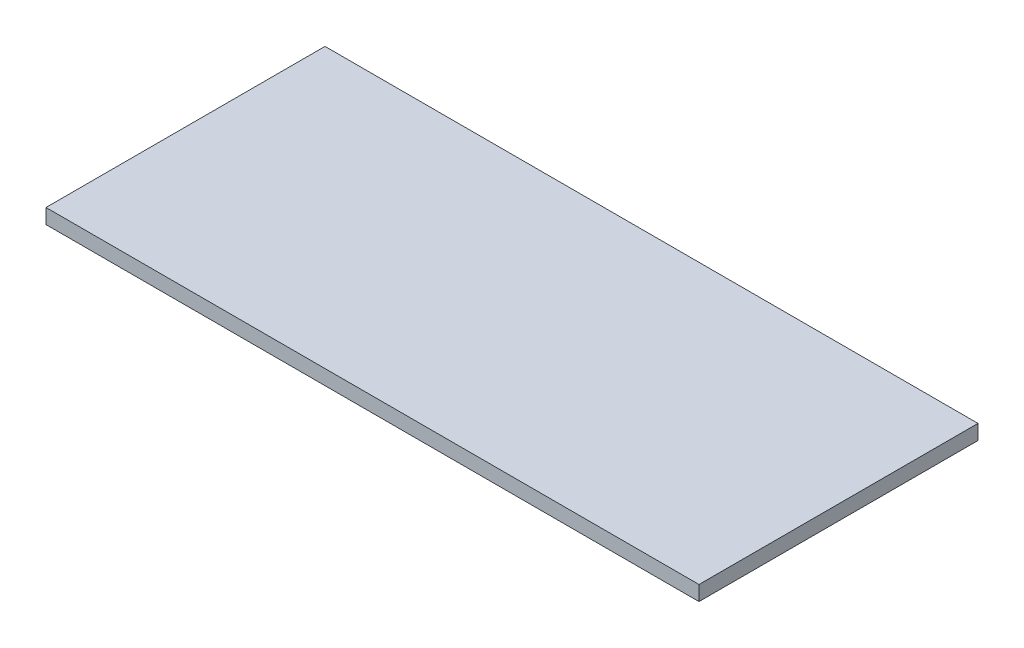
ISO-10303-21;
HEADER;
FILE_DESCRIPTION(('STEP AP214'),'2;1');
FILE_NAME('part.step','',(''),(''),'','','');
FILE_SCHEMA(('AUTOMOTIVE_DESIGN { 1 0 10303 214 1 1 1 1 }'));
ENDSEC;
DATA;
#1=APPLICATION_CONTEXT('core data for automotive mechanical design processes');
#2=APPLICATION_PROTOCOL_DEFINITION('international standard','automotive_design',2000,#1);
#3=PRODUCT_CONTEXT('',#1,'mechanical');
#4=PRODUCT('Part','Part','',(#3));
#5=PRODUCT_RELATED_PRODUCT_CATEGORY('part','',(#4));
#6=PRODUCT_DEFINITION_FORMATION('','',#4);
#7=PRODUCT_DEFINITION_CONTEXT('part definition',#1,'design');
#8=PRODUCT_DEFINITION('design','',#6,#7);
#9=PRODUCT_DEFINITION_SHAPE('','',#8);
#10=(LENGTH_UNIT() NAMED_UNIT(*) SI_UNIT(.MILLI.,.METRE.));
#11=(NAMED_UNIT(*) PLANE_ANGLE_UNIT() SI_UNIT($,.RADIAN.));
#12=(NAMED_UNIT(*) SI_UNIT($,.STERADIAN.) SOLID_ANGLE_UNIT());
#13=UNCERTAINTY_MEASURE_WITH_UNIT(LENGTH_MEASURE(1.E-05),#10,'distance_accuracy_value','');
#14=(GEOMETRIC_REPRESENTATION_CONTEXT(3) GLOBAL_UNCERTAINTY_ASSIGNED_CONTEXT((#13)) GLOBAL_UNIT_ASSIGNED_CONTEXT((#10,
#11,#12)) REPRESENTATION_CONTEXT('',''));
#15=CARTESIAN_POINT('',(0.,0.,0.));
#16=DIRECTION('',(0.,0.,1.));
#17=DIRECTION('',(1.,0.,0.));
#18=AXIS2_PLACEMENT_3D('',#15,#16,#17);
#19=CARTESIAN_POINT('',(0.,6.35,0.));
#20=DIRECTION('',(1.,0.,0.));
#21=DIRECTION('',(0.,0.,-1.));
#22=AXIS2_PLACEMENT_3D('',#19,#20,#21);
#23=PLANE('',#22);
#24=DIRECTION('',(0.,0.,1.));
#25=VECTOR('',#24,1.);
#26=CARTESIAN_POINT('',(0.,0.,0.));
#27=LINE('',#26,#25);
#28=CARTESIAN_POINT('',(0.,0.,-119.38));
#29=VERTEX_POINT('',#28);
#30=CARTESIAN_POINT('',(0.,0.,0.));
#31=VERTEX_POINT('',#30);
#32=EDGE_CURVE('E99',#29,#31,#27,.T.);
#33=ORIENTED_EDGE('',*,*,#32,.T.);
#34=DIRECTION('',(0.,-1.,0.));
#35=VECTOR('',#34,1.);
#36=CARTESIAN_POINT('',(0.,6.35,0.));
#37=LINE('',#36,#35);
#38=CARTESIAN_POINT('',(0.,6.35,0.));
#39=VERTEX_POINT('',#38);
#40=EDGE_CURVE('E11',#39,#31,#37,.T.);
#41=ORIENTED_EDGE('',*,*,#40,.F.);
#42=DIRECTION('',(0.,0.,1.));
#43=VECTOR('',#42,1.);
#44=CARTESIAN_POINT('',(0.,6.35,0.));
#45=LINE('',#44,#43);
#46=CARTESIAN_POINT('',(0.,6.35,-119.38));
#47=VERTEX_POINT('',#46);
#48=EDGE_CURVE('E87',#47,#39,#45,.T.);
#49=ORIENTED_EDGE('',*,*,#48,.F.);
#50=DIRECTION('',(0.,-1.,0.));
#51=VECTOR('',#50,1.);
#52=CARTESIAN_POINT('',(0.,6.35,-119.38));
#53=LINE('',#52,#51);
#54=EDGE_CURVE('E95',#47,#29,#53,.T.);
#55=ORIENTED_EDGE('',*,*,#54,.T.);
#56=EDGE_LOOP('',(#33,#41,#49,#55));
#57=FACE_BOUND('',#56,.T.);
#58=ADVANCED_FACE('F36',(#57),#23,.F.);
#59=CARTESIAN_POINT('',(0.,6.35,0.));
#60=DIRECTION('',(0.,0.,-1.));
#61=DIRECTION('',(-1.,0.,0.));
#62=AXIS2_PLACEMENT_3D('',#59,#60,#61);
#63=PLANE('',#62);
#64=DIRECTION('',(1.,0.,0.));
#65=VECTOR('',#64,1.);
#66=CARTESIAN_POINT('',(0.,0.,0.));
#67=LINE('',#66,#65);
#68=CARTESIAN_POINT('',(279.4,0.,0.));
#69=VERTEX_POINT('',#68);
#70=EDGE_CURVE('E91',#31,#69,#67,.T.);
#71=ORIENTED_EDGE('',*,*,#70,.T.);
#72=DIRECTION('',(0.,-1.,0.));
#73=VECTOR('',#72,1.);
#74=CARTESIAN_POINT('',(279.4,6.35,0.));
#75=LINE('',#74,#73);
#76=CARTESIAN_POINT('',(279.4,6.35,0.));
#77=VERTEX_POINT('',#76);
#78=EDGE_CURVE('E44',#77,#69,#75,.T.);
#79=ORIENTED_EDGE('',*,*,#78,.F.);
#80=DIRECTION('',(1.,0.,0.));
#81=VECTOR('',#80,1.);
#82=CARTESIAN_POINT('',(0.,6.35,0.));
#83=LINE('',#82,#81);
#84=EDGE_CURVE('E82',#39,#77,#83,.T.);
#85=ORIENTED_EDGE('',*,*,#84,.F.);
#86=ORIENTED_EDGE('',*,*,#40,.T.);
#87=EDGE_LOOP('',(#71,#79,#85,#86));
#88=FACE_BOUND('',#87,.T.);
#89=ADVANCED_FACE('F90',(#88),#63,.F.);
#90=CARTESIAN_POINT('',(279.4,6.35,0.));
#91=DIRECTION('',(-1.,0.,0.));
#92=DIRECTION('',(0.,0.,1.));
#93=AXIS2_PLACEMENT_3D('',#90,#91,#92);
#94=PLANE('',#93);
#95=DIRECTION('',(0.,0.,-1.));
#96=VECTOR('',#95,1.);
#97=CARTESIAN_POINT('',(279.4,0.,0.));
#98=LINE('',#97,#96);
#99=CARTESIAN_POINT('',(279.4,0.,-119.38));
#100=VERTEX_POINT('',#99);
#101=EDGE_CURVE('E69',#69,#100,#98,.T.);
#102=ORIENTED_EDGE('',*,*,#101,.T.);
#103=DIRECTION('',(0.,-1.,0.));
#104=VECTOR('',#103,1.);
#105=CARTESIAN_POINT('',(279.4,6.35,-119.38));
#106=LINE('',#105,#104);
#107=CARTESIAN_POINT('',(279.4,6.35,-119.38));
#108=VERTEX_POINT('',#107);
#109=EDGE_CURVE('E92',#108,#100,#106,.T.);
#110=ORIENTED_EDGE('',*,*,#109,.F.);
#111=DIRECTION('',(0.,0.,-1.));
#112=VECTOR('',#111,1.);
#113=CARTESIAN_POINT('',(279.4,6.35,0.));
#114=LINE('',#113,#112);
#115=EDGE_CURVE('E85',#77,#108,#114,.T.);
#116=ORIENTED_EDGE('',*,*,#115,.F.);
#117=ORIENTED_EDGE('',*,*,#78,.T.);
#118=EDGE_LOOP('',(#102,#110,#116,#117));
#119=FACE_BOUND('',#118,.T.);
#120=ADVANCED_FACE('F93',(#119),#94,.F.);
#121=CARTESIAN_POINT('',(0.,6.35,-119.38));
#122=DIRECTION('',(0.,0.,1.));
#123=DIRECTION('',(1.,0.,0.));
#124=AXIS2_PLACEMENT_3D('',#121,#122,#123);
#125=PLANE('',#124);
#126=DIRECTION('',(-1.,0.,0.));
#127=VECTOR('',#126,1.);
#128=CARTESIAN_POINT('',(0.,0.,-119.38));
#129=LINE('',#128,#127);
#130=EDGE_CURVE('E75',#100,#29,#129,.T.);
#131=ORIENTED_EDGE('',*,*,#130,.T.);
#132=ORIENTED_EDGE('',*,*,#54,.F.);
#133=DIRECTION('',(-1.,0.,0.));
#134=VECTOR('',#133,1.);
#135=CARTESIAN_POINT('',(0.,6.35,-119.38));
#136=LINE('',#135,#134);
#137=EDGE_CURVE('E52',#108,#47,#136,.T.);
#138=ORIENTED_EDGE('',*,*,#137,.F.);
#139=ORIENTED_EDGE('',*,*,#109,.T.);
#140=EDGE_LOOP('',(#131,#132,#138,#139));
#141=FACE_BOUND('',#140,.T.);
#142=ADVANCED_FACE('F106',(#141),#125,.F.);
#143=CARTESIAN_POINT('',(0.,6.35,0.));
#144=DIRECTION('',(0.,-1.,0.));
#145=DIRECTION('',(0.,0.,-1.));
#146=AXIS2_PLACEMENT_3D('',#143,#144,#145);
#147=PLANE('',#146);
#148=ORIENTED_EDGE('',*,*,#48,.T.);
#149=ORIENTED_EDGE('',*,*,#84,.T.);
#150=ORIENTED_EDGE('',*,*,#115,.T.);
#151=ORIENTED_EDGE('',*,*,#137,.T.);
#152=EDGE_LOOP('',(#148,#149,#150,#151));
#153=FACE_BOUND('',#152,.T.);
#154=ADVANCED_FACE('F83',(#153),#147,.F.);
#155=CARTESIAN_POINT('',(0.,0.,0.));
#156=DIRECTION('',(0.,-1.,0.));
#157=DIRECTION('',(0.,0.,-1.));
#158=AXIS2_PLACEMENT_3D('',#155,#156,#157);
#159=PLANE('',#158);
#160=ORIENTED_EDGE('',*,*,#32,.F.);
#161=ORIENTED_EDGE('',*,*,#130,.F.);
#162=ORIENTED_EDGE('',*,*,#101,.F.);
#163=ORIENTED_EDGE('',*,*,#70,.F.);
#164=EDGE_LOOP('',(#160,#161,#162,#163));
#165=FACE_BOUND('',#164,.T.);
#166=ADVANCED_FACE('F109',(#165),#159,.T.);
#167=CLOSED_SHELL('',(#58,#89,#120,#142,#154,#166));
#168=MANIFOLD_SOLID_BREP('B2',#167);
#169=ADVANCED_BREP_SHAPE_REPRESENTATION('',(#18,#168),#14);
#170=SHAPE_DEFINITION_REPRESENTATION(#9,#169);
ENDSEC;
END-ISO-10303-21;
